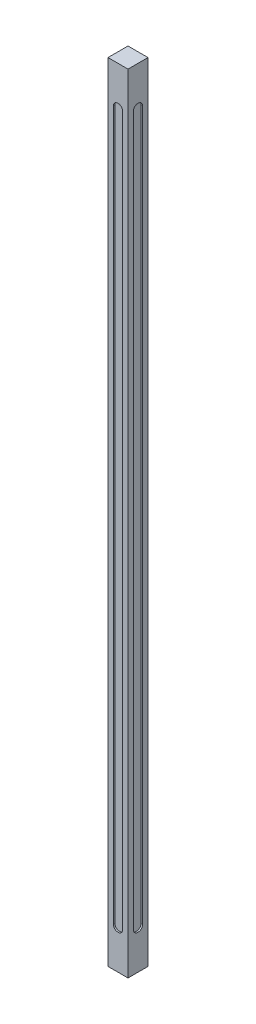
ISO-10303-21;
HEADER;
FILE_DESCRIPTION(('STEP AP214'),'2;1');
FILE_NAME('part.step','',(''),(''),'','','');
FILE_SCHEMA(('AUTOMOTIVE_DESIGN { 1 0 10303 214 1 1 1 1 }'));
ENDSEC;
DATA;
#1=APPLICATION_CONTEXT('core data for automotive mechanical design processes');
#2=APPLICATION_PROTOCOL_DEFINITION('international standard','automotive_design',2000,#1);
#3=PRODUCT_CONTEXT('',#1,'mechanical');
#4=PRODUCT('Part','Part','',(#3));
#5=PRODUCT_RELATED_PRODUCT_CATEGORY('part','',(#4));
#6=PRODUCT_DEFINITION_FORMATION('','',#4);
#7=PRODUCT_DEFINITION_CONTEXT('part definition',#1,'design');
#8=PRODUCT_DEFINITION('design','',#6,#7);
#9=PRODUCT_DEFINITION_SHAPE('','',#8);
#10=(LENGTH_UNIT() NAMED_UNIT(*) SI_UNIT(.MILLI.,.METRE.));
#11=(NAMED_UNIT(*) PLANE_ANGLE_UNIT() SI_UNIT($,.RADIAN.));
#12=(NAMED_UNIT(*) SI_UNIT($,.STERADIAN.) SOLID_ANGLE_UNIT());
#13=UNCERTAINTY_MEASURE_WITH_UNIT(LENGTH_MEASURE(1.E-05),#10,'distance_accuracy_value','');
#14=(GEOMETRIC_REPRESENTATION_CONTEXT(3) GLOBAL_UNCERTAINTY_ASSIGNED_CONTEXT((#13)) GLOBAL_UNIT_ASSIGNED_CONTEXT((#10,
#11,#12)) REPRESENTATION_CONTEXT('',''));
#15=CARTESIAN_POINT('',(0.,0.,0.));
#16=DIRECTION('',(0.,0.,1.));
#17=DIRECTION('',(1.,0.,0.));
#18=AXIS2_PLACEMENT_3D('',#15,#16,#17);
#19=CARTESIAN_POINT('',(-12.7,500.,12.7));
#20=DIRECTION('',(1.,0.,0.));
#21=DIRECTION('',(0.,0.,-1.));
#22=AXIS2_PLACEMENT_3D('',#19,#20,#21);
#23=PLANE('',#22);
#24=DIRECTION('',(0.,-1.,0.));
#25=VECTOR('',#24,1.);
#26=CARTESIAN_POINT('',(-12.7,450.,-6.00000000000017));
#27=LINE('',#26,#25);
#28=CARTESIAN_POINT('',(-12.7,450.,-6.00000000000017));
#29=VERTEX_POINT('',#28);
#30=CARTESIAN_POINT('',(-12.7,-450.,-5.99999999999989));
#31=VERTEX_POINT('',#30);
#32=EDGE_CURVE('E212',#29,#31,#27,.T.);
#33=ORIENTED_EDGE('',*,*,#32,.F.);
#34=CARTESIAN_POINT('',(-12.7,450.,-1.66978326577683E-13));
#35=DIRECTION('',(-1.,0.,0.));
#36=DIRECTION('',(0.,0.,1.));
#37=AXIS2_PLACEMENT_3D('',#34,#35,#36);
#38=CIRCLE('',#37,6.);
#39=CARTESIAN_POINT('',(-12.7,450.,5.99999999999984));
#40=VERTEX_POINT('',#39);
#41=EDGE_CURVE('E54',#40,#29,#38,.T.);
#42=ORIENTED_EDGE('',*,*,#41,.F.);
#43=DIRECTION('',(0.,1.,0.));
#44=VECTOR('',#43,1.);
#45=CARTESIAN_POINT('',(-12.7,450.,5.99999999999984));
#46=LINE('',#45,#44);
#47=CARTESIAN_POINT('',(-12.7,-450.,6.00000000000011));
#48=VERTEX_POINT('',#47);
#49=EDGE_CURVE('E199',#48,#40,#46,.T.);
#50=ORIENTED_EDGE('',*,*,#49,.F.);
#51=CARTESIAN_POINT('',(-12.7,-450.,1.08567203230471E-13));
#52=DIRECTION('',(-1.,0.,0.));
#53=DIRECTION('',(0.,0.,1.));
#54=AXIS2_PLACEMENT_3D('',#51,#52,#53);
#55=CIRCLE('',#54,6.);
#56=EDGE_CURVE('E203',#31,#48,#55,.T.);
#57=ORIENTED_EDGE('',*,*,#56,.F.);
#58=EDGE_LOOP('',(#33,#42,#50,#57));
#59=FACE_BOUND('',#58,.T.);
#60=DIRECTION('',(0.,0.,1.));
#61=VECTOR('',#60,1.);
#62=CARTESIAN_POINT('',(-12.7,-500.,12.7));
#63=LINE('',#62,#61);
#64=CARTESIAN_POINT('',(-12.7,-500.,-12.7));
#65=VERTEX_POINT('',#64);
#66=CARTESIAN_POINT('',(-12.7,-500.,12.7));
#67=VERTEX_POINT('',#66);
#68=EDGE_CURVE('E347',#65,#67,#63,.T.);
#69=ORIENTED_EDGE('',*,*,#68,.T.);
#70=DIRECTION('',(0.,-1.,0.));
#71=VECTOR('',#70,1.);
#72=CARTESIAN_POINT('',(-12.7,500.,12.7));
#73=LINE('',#72,#71);
#74=CARTESIAN_POINT('',(-12.7,500.,12.7));
#75=VERTEX_POINT('',#74);
#76=EDGE_CURVE('E11',#75,#67,#73,.T.);
#77=ORIENTED_EDGE('',*,*,#76,.F.);
#78=DIRECTION('',(0.,0.,1.));
#79=VECTOR('',#78,1.);
#80=CARTESIAN_POINT('',(-12.7,500.,12.7));
#81=LINE('',#80,#79);
#82=CARTESIAN_POINT('',(-12.7,500.,-12.7));
#83=VERTEX_POINT('',#82);
#84=EDGE_CURVE('E357',#83,#75,#81,.T.);
#85=ORIENTED_EDGE('',*,*,#84,.F.);
#86=DIRECTION('',(0.,-1.,0.));
#87=VECTOR('',#86,1.);
#88=CARTESIAN_POINT('',(-12.7,500.,-12.7));
#89=LINE('',#88,#87);
#90=EDGE_CURVE('E371',#83,#65,#89,.T.);
#91=ORIENTED_EDGE('',*,*,#90,.T.);
#92=EDGE_LOOP('',(#69,#77,#85,#91));
#93=FACE_BOUND('',#92,.T.);
#94=ADVANCED_FACE('F39',(#59,#93),#23,.F.);
#95=CARTESIAN_POINT('',(12.7,500.,12.7));
#96=DIRECTION('',(0.,0.,-1.));
#97=DIRECTION('',(-1.,0.,0.));
#98=AXIS2_PLACEMENT_3D('',#95,#96,#97);
#99=PLANE('',#98);
#100=DIRECTION('',(0.,-1.,0.));
#101=VECTOR('',#100,1.);
#102=CARTESIAN_POINT('',(-6.00000000000021,450.,12.7));
#103=LINE('',#102,#101);
#104=CARTESIAN_POINT('',(-6.00000000000021,450.,12.7));
#105=VERTEX_POINT('',#104);
#106=CARTESIAN_POINT('',(-5.99999999999993,-450.,12.7));
#107=VERTEX_POINT('',#106);
#108=EDGE_CURVE('E333',#105,#107,#103,.T.);
#109=ORIENTED_EDGE('',*,*,#108,.F.);
#110=CARTESIAN_POINT('',(-2.09939286241244E-13,450.,12.7));
#111=DIRECTION('',(0.,0.,1.));
#112=DIRECTION('',(1.,0.,0.));
#113=AXIS2_PLACEMENT_3D('',#110,#111,#112);
#114=CIRCLE('',#113,6.);
#115=CARTESIAN_POINT('',(5.99999999999979,450.,12.7));
#116=VERTEX_POINT('',#115);
#117=EDGE_CURVE('E303',#116,#105,#114,.T.);
#118=ORIENTED_EDGE('',*,*,#117,.F.);
#119=DIRECTION('',(0.,1.,0.));
#120=VECTOR('',#119,1.);
#121=CARTESIAN_POINT('',(5.99999999999979,450.,12.7));
#122=LINE('',#121,#120);
#123=CARTESIAN_POINT('',(6.00000000000006,-450.,12.7));
#124=VERTEX_POINT('',#123);
#125=EDGE_CURVE('E318',#124,#116,#122,.T.);
#126=ORIENTED_EDGE('',*,*,#125,.F.);
#127=CARTESIAN_POINT('',(0.,-450.,12.7));
#128=DIRECTION('',(0.,0.,1.));
#129=DIRECTION('',(1.,0.,0.));
#130=AXIS2_PLACEMENT_3D('',#127,#128,#129);
#131=CIRCLE('',#130,6.);
#132=EDGE_CURVE('E337',#107,#124,#131,.T.);
#133=ORIENTED_EDGE('',*,*,#132,.F.);
#134=EDGE_LOOP('',(#109,#118,#126,#133));
#135=FACE_BOUND('',#134,.T.);
#136=DIRECTION('',(1.,0.,0.));
#137=VECTOR('',#136,1.);
#138=CARTESIAN_POINT('',(12.7,-500.,12.7));
#139=LINE('',#138,#137);
#140=CARTESIAN_POINT('',(12.7,-500.,12.7));
#141=VERTEX_POINT('',#140);
#142=EDGE_CURVE('E375',#67,#141,#139,.T.);
#143=ORIENTED_EDGE('',*,*,#142,.T.);
#144=DIRECTION('',(0.,-1.,0.));
#145=VECTOR('',#144,1.);
#146=CARTESIAN_POINT('',(12.7,500.,12.7));
#147=LINE('',#146,#145);
#148=CARTESIAN_POINT('',(12.7,500.,12.7));
#149=VERTEX_POINT('',#148);
#150=EDGE_CURVE('E47',#149,#141,#147,.T.);
#151=ORIENTED_EDGE('',*,*,#150,.F.);
#152=DIRECTION('',(1.,0.,0.));
#153=VECTOR('',#152,1.);
#154=CARTESIAN_POINT('',(12.7,500.,12.7));
#155=LINE('',#154,#153);
#156=EDGE_CURVE('E361',#75,#149,#155,.T.);
#157=ORIENTED_EDGE('',*,*,#156,.F.);
#158=ORIENTED_EDGE('',*,*,#76,.T.);
#159=EDGE_LOOP('',(#143,#151,#157,#158));
#160=FACE_BOUND('',#159,.T.);
#161=ADVANCED_FACE('F411',(#135,#160),#99,.F.);
#162=CARTESIAN_POINT('',(12.7,500.,12.7));
#163=DIRECTION('',(-1.,0.,0.));
#164=DIRECTION('',(0.,0.,1.));
#165=AXIS2_PLACEMENT_3D('',#162,#163,#164);
#166=PLANE('',#165);
#167=DIRECTION('',(0.,-1.,0.));
#168=VECTOR('',#167,1.);
#169=CARTESIAN_POINT('',(12.7,450.,6.00000000000017));
#170=LINE('',#169,#168);
#171=CARTESIAN_POINT('',(12.7,450.,6.00000000000017));
#172=VERTEX_POINT('',#171);
#173=CARTESIAN_POINT('',(12.7,-450.,5.99999999999989));
#174=VERTEX_POINT('',#173);
#175=EDGE_CURVE('E289',#172,#174,#170,.T.);
#176=ORIENTED_EDGE('',*,*,#175,.F.);
#177=CARTESIAN_POINT('',(12.7,450.,1.64859035190274E-13));
#178=DIRECTION('',(1.,0.,0.));
#179=DIRECTION('',(0.,0.,-1.));
#180=AXIS2_PLACEMENT_3D('',#177,#178,#179);
#181=CIRCLE('',#180,6.);
#182=CARTESIAN_POINT('',(12.7,450.,-5.99999999999983));
#183=VERTEX_POINT('',#182);
#184=EDGE_CURVE('E260',#183,#172,#181,.T.);
#185=ORIENTED_EDGE('',*,*,#184,.F.);
#186=DIRECTION('',(0.,1.,0.));
#187=VECTOR('',#186,1.);
#188=CARTESIAN_POINT('',(12.7,450.,-5.99999999999983));
#189=LINE('',#188,#187);
#190=CARTESIAN_POINT('',(12.7,-450.,-6.00000000000011));
#191=VERTEX_POINT('',#190);
#192=EDGE_CURVE('E274',#191,#183,#189,.T.);
#193=ORIENTED_EDGE('',*,*,#192,.F.);
#194=CARTESIAN_POINT('',(12.7,-450.,-1.1068649461788E-13));
#195=DIRECTION('',(1.,0.,0.));
#196=DIRECTION('',(0.,0.,-1.));
#197=AXIS2_PLACEMENT_3D('',#194,#195,#196);
#198=CIRCLE('',#197,6.);
#199=EDGE_CURVE('E293',#174,#191,#198,.T.);
#200=ORIENTED_EDGE('',*,*,#199,.F.);
#201=EDGE_LOOP('',(#176,#185,#193,#200));
#202=FACE_BOUND('',#201,.T.);
#203=DIRECTION('',(0.,0.,-1.));
#204=VECTOR('',#203,1.);
#205=CARTESIAN_POINT('',(12.7,-500.,12.7));
#206=LINE('',#205,#204);
#207=CARTESIAN_POINT('',(12.7,-500.,-12.7));
#208=VERTEX_POINT('',#207);
#209=EDGE_CURVE('E378',#141,#208,#206,.T.);
#210=ORIENTED_EDGE('',*,*,#209,.T.);
#211=DIRECTION('',(0.,-1.,0.));
#212=VECTOR('',#211,1.);
#213=CARTESIAN_POINT('',(12.7,500.,-12.7));
#214=LINE('',#213,#212);
#215=CARTESIAN_POINT('',(12.7,500.,-12.7));
#216=VERTEX_POINT('',#215);
#217=EDGE_CURVE('E386',#216,#208,#214,.T.);
#218=ORIENTED_EDGE('',*,*,#217,.F.);
#219=DIRECTION('',(0.,0.,-1.));
#220=VECTOR('',#219,1.);
#221=CARTESIAN_POINT('',(12.7,500.,12.7));
#222=LINE('',#221,#220);
#223=EDGE_CURVE('E365',#149,#216,#222,.T.);
#224=ORIENTED_EDGE('',*,*,#223,.F.);
#225=ORIENTED_EDGE('',*,*,#150,.T.);
#226=EDGE_LOOP('',(#210,#218,#224,#225));
#227=FACE_BOUND('',#226,.T.);
#228=ADVANCED_FACE('F395',(#202,#227),#166,.F.);
#229=CARTESIAN_POINT('',(12.7,500.,-12.7));
#230=DIRECTION('',(0.,0.,1.));
#231=DIRECTION('',(1.,0.,0.));
#232=AXIS2_PLACEMENT_3D('',#229,#230,#231);
#233=PLANE('',#232);
#234=DIRECTION('',(0.,-1.,0.));
#235=VECTOR('',#234,1.);
#236=CARTESIAN_POINT('',(6.00000000000016,450.,-12.7));
#237=LINE('',#236,#235);
#238=CARTESIAN_POINT('',(6.00000000000016,450.,-12.7));
#239=VERTEX_POINT('',#238);
#240=CARTESIAN_POINT('',(5.99999999999989,-450.,-12.7));
#241=VERTEX_POINT('',#240);
#242=EDGE_CURVE('E246',#239,#241,#237,.T.);
#243=ORIENTED_EDGE('',*,*,#242,.F.);
#244=CARTESIAN_POINT('',(1.66623756488601E-13,450.,-12.7));
#245=DIRECTION('',(0.,0.,-1.));
#246=DIRECTION('',(-1.,0.,0.));
#247=AXIS2_PLACEMENT_3D('',#244,#245,#246);
#248=CIRCLE('',#247,6.);
#249=CARTESIAN_POINT('',(-5.99999999999984,450.,-12.7));
#250=VERTEX_POINT('',#249);
#251=EDGE_CURVE('E62',#250,#239,#248,.T.);
#252=ORIENTED_EDGE('',*,*,#251,.F.);
#253=DIRECTION('',(0.,1.,0.));
#254=VECTOR('',#253,1.);
#255=CARTESIAN_POINT('',(-5.99999999999984,450.,-12.7));
#256=LINE('',#255,#254);
#257=CARTESIAN_POINT('',(-6.00000000000011,-450.,-12.7));
#258=VERTEX_POINT('',#257);
#259=EDGE_CURVE('E231',#258,#250,#256,.T.);
#260=ORIENTED_EDGE('',*,*,#259,.F.);
#261=CARTESIAN_POINT('',(-1.08921773319553E-13,-450.,-12.7));
#262=DIRECTION('',(0.,0.,-1.));
#263=DIRECTION('',(-1.,0.,0.));
#264=AXIS2_PLACEMENT_3D('',#261,#262,#263);
#265=CIRCLE('',#264,6.);
#266=EDGE_CURVE('E250',#241,#258,#265,.T.);
#267=ORIENTED_EDGE('',*,*,#266,.F.);
#268=EDGE_LOOP('',(#243,#252,#260,#267));
#269=FACE_BOUND('',#268,.T.);
#270=DIRECTION('',(-1.,0.,0.));
#271=VECTOR('',#270,1.);
#272=CARTESIAN_POINT('',(12.7,-500.,-12.7));
#273=LINE('',#272,#271);
#274=EDGE_CURVE('E362',#208,#65,#273,.T.);
#275=ORIENTED_EDGE('',*,*,#274,.T.);
#276=ORIENTED_EDGE('',*,*,#90,.F.);
#277=DIRECTION('',(-1.,0.,0.));
#278=VECTOR('',#277,1.);
#279=CARTESIAN_POINT('',(12.7,500.,-12.7));
#280=LINE('',#279,#278);
#281=EDGE_CURVE('E368',#216,#83,#280,.T.);
#282=ORIENTED_EDGE('',*,*,#281,.F.);
#283=ORIENTED_EDGE('',*,*,#217,.T.);
#284=EDGE_LOOP('',(#275,#276,#282,#283));
#285=FACE_BOUND('',#284,.T.);
#286=ADVANCED_FACE('F404',(#269,#285),#233,.F.);
#287=CARTESIAN_POINT('',(0.,500.,0.));
#288=DIRECTION('',(0.,1.,0.));
#289=DIRECTION('',(0.,0.,1.));
#290=AXIS2_PLACEMENT_3D('',#287,#288,#289);
#291=PLANE('',#290);
#292=ORIENTED_EDGE('',*,*,#84,.T.);
#293=ORIENTED_EDGE('',*,*,#156,.T.);
#294=ORIENTED_EDGE('',*,*,#223,.T.);
#295=ORIENTED_EDGE('',*,*,#281,.T.);
#296=EDGE_LOOP('',(#292,#293,#294,#295));
#297=FACE_BOUND('',#296,.T.);
#298=ADVANCED_FACE('F410',(#297),#291,.T.);
#299=CARTESIAN_POINT('',(0.,-500.,0.));
#300=DIRECTION('',(0.,1.,0.));
#301=DIRECTION('',(0.,0.,1.));
#302=AXIS2_PLACEMENT_3D('',#299,#300,#301);
#303=PLANE('',#302);
#304=ORIENTED_EDGE('',*,*,#68,.F.);
#305=ORIENTED_EDGE('',*,*,#274,.F.);
#306=ORIENTED_EDGE('',*,*,#209,.F.);
#307=ORIENTED_EDGE('',*,*,#142,.F.);
#308=EDGE_LOOP('',(#304,#305,#306,#307));
#309=FACE_BOUND('',#308,.T.);
#310=ADVANCED_FACE('F401',(#309),#303,.F.);
#311=CARTESIAN_POINT('',(-2.09939286241244E-13,450.,10.7));
#312=DIRECTION('',(0.,0.,1.));
#313=DIRECTION('',(1.,0.,0.));
#314=AXIS2_PLACEMENT_3D('',#311,#312,#313);
#315=CYLINDRICAL_SURFACE('',#314,6.);
#316=ORIENTED_EDGE('',*,*,#117,.T.);
#317=DIRECTION('',(0.,0.,1.));
#318=VECTOR('',#317,1.);
#319=CARTESIAN_POINT('',(-6.00000000000021,450.,10.7));
#320=LINE('',#319,#318);
#321=CARTESIAN_POINT('',(-6.00000000000021,450.,10.7));
#322=VERTEX_POINT('',#321);
#323=EDGE_CURVE('E330',#322,#105,#320,.T.);
#324=ORIENTED_EDGE('',*,*,#323,.F.);
#325=CARTESIAN_POINT('',(-2.09939286241244E-13,450.,10.7));
#326=DIRECTION('',(0.,0.,1.));
#327=DIRECTION('',(1.,0.,0.));
#328=AXIS2_PLACEMENT_3D('',#325,#326,#327);
#329=CIRCLE('',#328,6.);
#330=CARTESIAN_POINT('',(5.99999999999979,450.,10.7));
#331=VERTEX_POINT('',#330);
#332=EDGE_CURVE('E313',#331,#322,#329,.T.);
#333=ORIENTED_EDGE('',*,*,#332,.F.);
#334=DIRECTION('',(0.,0.,1.));
#335=VECTOR('',#334,1.);
#336=CARTESIAN_POINT('',(5.99999999999979,450.,10.7));
#337=LINE('',#336,#335);
#338=EDGE_CURVE('E344',#331,#116,#337,.T.);
#339=ORIENTED_EDGE('',*,*,#338,.T.);
#340=EDGE_LOOP('',(#316,#324,#333,#339));
#341=FACE_BOUND('',#340,.T.);
#342=ADVANCED_FACE('F428',(#341),#315,.F.);
#343=CARTESIAN_POINT('',(5.99999999999979,450.,10.7));
#344=DIRECTION('',(1.,0.,0.));
#345=DIRECTION('',(0.,1.,0.));
#346=AXIS2_PLACEMENT_3D('',#343,#344,#345);
#347=PLANE('',#346);
#348=ORIENTED_EDGE('',*,*,#125,.T.);
#349=ORIENTED_EDGE('',*,*,#338,.F.);
#350=DIRECTION('',(0.,1.,0.));
#351=VECTOR('',#350,1.);
#352=CARTESIAN_POINT('',(5.99999999999979,450.,10.7));
#353=LINE('',#352,#351);
#354=CARTESIAN_POINT('',(6.00000000000006,-450.,10.7));
#355=VERTEX_POINT('',#354);
#356=EDGE_CURVE('E326',#355,#331,#353,.T.);
#357=ORIENTED_EDGE('',*,*,#356,.F.);
#358=DIRECTION('',(0.,0.,1.));
#359=VECTOR('',#358,1.);
#360=CARTESIAN_POINT('',(6.00000000000006,-450.,10.7));
#361=LINE('',#360,#359);
#362=EDGE_CURVE('E348',#355,#124,#361,.T.);
#363=ORIENTED_EDGE('',*,*,#362,.T.);
#364=EDGE_LOOP('',(#348,#349,#357,#363));
#365=FACE_BOUND('',#364,.T.);
#366=ADVANCED_FACE('F433',(#365),#347,.F.);
#367=CARTESIAN_POINT('',(0.,-450.,10.7));
#368=DIRECTION('',(0.,0.,1.));
#369=DIRECTION('',(1.,0.,0.));
#370=AXIS2_PLACEMENT_3D('',#367,#368,#369);
#371=CYLINDRICAL_SURFACE('',#370,6.);
#372=ORIENTED_EDGE('',*,*,#132,.T.);
#373=ORIENTED_EDGE('',*,*,#362,.F.);
#374=CARTESIAN_POINT('',(0.,-450.,10.7));
#375=DIRECTION('',(0.,0.,1.));
#376=DIRECTION('',(1.,0.,0.));
#377=AXIS2_PLACEMENT_3D('',#374,#375,#376);
#378=CIRCLE('',#377,6.);
#379=CARTESIAN_POINT('',(-5.99999999999993,-450.,10.7));
#380=VERTEX_POINT('',#379);
#381=EDGE_CURVE('E322',#380,#355,#378,.T.);
#382=ORIENTED_EDGE('',*,*,#381,.F.);
#383=DIRECTION('',(0.,0.,1.));
#384=VECTOR('',#383,1.);
#385=CARTESIAN_POINT('',(-5.99999999999993,-450.,10.7));
#386=LINE('',#385,#384);
#387=EDGE_CURVE('E351',#380,#107,#386,.T.);
#388=ORIENTED_EDGE('',*,*,#387,.T.);
#389=EDGE_LOOP('',(#372,#373,#382,#388));
#390=FACE_BOUND('',#389,.T.);
#391=ADVANCED_FACE('F439',(#390),#371,.F.);
#392=CARTESIAN_POINT('',(-6.00000000000021,450.,10.7));
#393=DIRECTION('',(-1.,0.,0.));
#394=DIRECTION('',(0.,-1.,0.));
#395=AXIS2_PLACEMENT_3D('',#392,#393,#394);
#396=PLANE('',#395);
#397=ORIENTED_EDGE('',*,*,#108,.T.);
#398=ORIENTED_EDGE('',*,*,#387,.F.);
#399=DIRECTION('',(0.,-1.,0.));
#400=VECTOR('',#399,1.);
#401=CARTESIAN_POINT('',(-6.00000000000021,450.,10.7));
#402=LINE('',#401,#400);
#403=EDGE_CURVE('E317',#322,#380,#402,.T.);
#404=ORIENTED_EDGE('',*,*,#403,.F.);
#405=ORIENTED_EDGE('',*,*,#323,.T.);
#406=EDGE_LOOP('',(#397,#398,#404,#405));
#407=FACE_BOUND('',#406,.T.);
#408=ADVANCED_FACE('F435',(#407),#396,.F.);
#409=CARTESIAN_POINT('',(-2.09939286241244E-13,450.,10.7));
#410=DIRECTION('',(0.,0.,1.));
#411=DIRECTION('',(1.,0.,0.));
#412=AXIS2_PLACEMENT_3D('',#409,#410,#411);
#413=PLANE('',#412);
#414=ORIENTED_EDGE('',*,*,#332,.T.);
#415=ORIENTED_EDGE('',*,*,#403,.T.);
#416=ORIENTED_EDGE('',*,*,#381,.T.);
#417=ORIENTED_EDGE('',*,*,#356,.T.);
#418=EDGE_LOOP('',(#414,#415,#416,#417));
#419=FACE_BOUND('',#418,.T.);
#420=ADVANCED_FACE('F438',(#419),#413,.T.);
#421=CARTESIAN_POINT('',(10.7,450.,1.64859035190274E-13));
#422=DIRECTION('',(1.,0.,0.));
#423=DIRECTION('',(0.,0.,-1.));
#424=AXIS2_PLACEMENT_3D('',#421,#422,#423);
#425=CYLINDRICAL_SURFACE('',#424,6.);
#426=ORIENTED_EDGE('',*,*,#184,.T.);
#427=DIRECTION('',(1.,0.,0.));
#428=VECTOR('',#427,1.);
#429=CARTESIAN_POINT('',(10.7,450.,6.00000000000017));
#430=LINE('',#429,#428);
#431=CARTESIAN_POINT('',(10.7,450.,6.00000000000017));
#432=VERTEX_POINT('',#431);
#433=EDGE_CURVE('E286',#432,#172,#430,.T.);
#434=ORIENTED_EDGE('',*,*,#433,.F.);
#435=CARTESIAN_POINT('',(10.7,450.,1.64859035190274E-13));
#436=DIRECTION('',(1.,0.,0.));
#437=DIRECTION('',(0.,0.,-1.));
#438=AXIS2_PLACEMENT_3D('',#435,#436,#437);
#439=CIRCLE('',#438,6.);
#440=CARTESIAN_POINT('',(10.7,450.,-5.99999999999983));
#441=VERTEX_POINT('',#440);
#442=EDGE_CURVE('E269',#441,#432,#439,.T.);
#443=ORIENTED_EDGE('',*,*,#442,.F.);
#444=DIRECTION('',(1.,0.,0.));
#445=VECTOR('',#444,1.);
#446=CARTESIAN_POINT('',(10.7,450.,-5.99999999999983));
#447=LINE('',#446,#445);
#448=EDGE_CURVE('E300',#441,#183,#447,.T.);
#449=ORIENTED_EDGE('',*,*,#448,.T.);
#450=EDGE_LOOP('',(#426,#434,#443,#449));
#451=FACE_BOUND('',#450,.T.);
#452=ADVANCED_FACE('F449',(#451),#425,.F.);
#453=CARTESIAN_POINT('',(10.7,450.,-5.99999999999983));
#454=DIRECTION('',(0.,0.,-1.));
#455=DIRECTION('',(0.,1.,0.));
#456=AXIS2_PLACEMENT_3D('',#453,#454,#455);
#457=PLANE('',#456);
#458=ORIENTED_EDGE('',*,*,#192,.T.);
#459=ORIENTED_EDGE('',*,*,#448,.F.);
#460=DIRECTION('',(0.,1.,0.));
#461=VECTOR('',#460,1.);
#462=CARTESIAN_POINT('',(10.7,450.,-5.99999999999983));
#463=LINE('',#462,#461);
#464=CARTESIAN_POINT('',(10.7,-450.,-6.00000000000011));
#465=VERTEX_POINT('',#464);
#466=EDGE_CURVE('E282',#465,#441,#463,.T.);
#467=ORIENTED_EDGE('',*,*,#466,.F.);
#468=DIRECTION('',(1.,0.,0.));
#469=VECTOR('',#468,1.);
#470=CARTESIAN_POINT('',(10.7,-450.,-6.00000000000011));
#471=LINE('',#470,#469);
#472=EDGE_CURVE('E304',#465,#191,#471,.T.);
#473=ORIENTED_EDGE('',*,*,#472,.T.);
#474=EDGE_LOOP('',(#458,#459,#467,#473));
#475=FACE_BOUND('',#474,.T.);
#476=ADVANCED_FACE('F453',(#475),#457,.F.);
#477=CARTESIAN_POINT('',(10.7,-450.,-1.1068649461788E-13));
#478=DIRECTION('',(1.,0.,0.));
#479=DIRECTION('',(0.,0.,-1.));
#480=AXIS2_PLACEMENT_3D('',#477,#478,#479);
#481=CYLINDRICAL_SURFACE('',#480,6.);
#482=ORIENTED_EDGE('',*,*,#199,.T.);
#483=ORIENTED_EDGE('',*,*,#472,.F.);
#484=CARTESIAN_POINT('',(10.7,-450.,-1.1068649461788E-13));
#485=DIRECTION('',(1.,0.,0.));
#486=DIRECTION('',(0.,0.,-1.));
#487=AXIS2_PLACEMENT_3D('',#484,#485,#486);
#488=CIRCLE('',#487,6.);
#489=CARTESIAN_POINT('',(10.7,-450.,5.99999999999989));
#490=VERTEX_POINT('',#489);
#491=EDGE_CURVE('E278',#490,#465,#488,.T.);
#492=ORIENTED_EDGE('',*,*,#491,.F.);
#493=DIRECTION('',(1.,0.,0.));
#494=VECTOR('',#493,1.);
#495=CARTESIAN_POINT('',(10.7,-450.,5.99999999999989));
#496=LINE('',#495,#494);
#497=EDGE_CURVE('E307',#490,#174,#496,.T.);
#498=ORIENTED_EDGE('',*,*,#497,.T.);
#499=EDGE_LOOP('',(#482,#483,#492,#498));
#500=FACE_BOUND('',#499,.T.);
#501=ADVANCED_FACE('F459',(#500),#481,.F.);
#502=CARTESIAN_POINT('',(10.7,450.,6.00000000000017));
#503=DIRECTION('',(0.,0.,1.));
#504=DIRECTION('',(0.,-1.,0.));
#505=AXIS2_PLACEMENT_3D('',#502,#503,#504);
#506=PLANE('',#505);
#507=ORIENTED_EDGE('',*,*,#175,.T.);
#508=ORIENTED_EDGE('',*,*,#497,.F.);
#509=DIRECTION('',(0.,-1.,0.));
#510=VECTOR('',#509,1.);
#511=CARTESIAN_POINT('',(10.7,450.,6.00000000000017));
#512=LINE('',#511,#510);
#513=EDGE_CURVE('E273',#432,#490,#512,.T.);
#514=ORIENTED_EDGE('',*,*,#513,.F.);
#515=ORIENTED_EDGE('',*,*,#433,.T.);
#516=EDGE_LOOP('',(#507,#508,#514,#515));
#517=FACE_BOUND('',#516,.T.);
#518=ADVANCED_FACE('F455',(#517),#506,.F.);
#519=CARTESIAN_POINT('',(10.7,450.,1.64859035190274E-13));
#520=DIRECTION('',(1.,0.,0.));
#521=DIRECTION('',(0.,0.,-1.));
#522=AXIS2_PLACEMENT_3D('',#519,#520,#521);
#523=PLANE('',#522);
#524=ORIENTED_EDGE('',*,*,#442,.T.);
#525=ORIENTED_EDGE('',*,*,#513,.T.);
#526=ORIENTED_EDGE('',*,*,#491,.T.);
#527=ORIENTED_EDGE('',*,*,#466,.T.);
#528=EDGE_LOOP('',(#524,#525,#526,#527));
#529=FACE_BOUND('',#528,.T.);
#530=ADVANCED_FACE('F458',(#529),#523,.T.);
#531=CARTESIAN_POINT('',(1.66896941287968E-13,450.,-10.7));
#532=DIRECTION('',(0.,0.,-1.));
#533=DIRECTION('',(-1.,0.,0.));
#534=AXIS2_PLACEMENT_3D('',#531,#532,#533);
#535=CYLINDRICAL_SURFACE('',#534,6.);
#536=ORIENTED_EDGE('',*,*,#251,.T.);
#537=DIRECTION('',(0.,0.,-1.));
#538=VECTOR('',#537,1.);
#539=CARTESIAN_POINT('',(6.00000000000016,450.,-10.7));
#540=LINE('',#539,#538);
#541=CARTESIAN_POINT('',(6.00000000000016,450.,-10.7));
#542=VERTEX_POINT('',#541);
#543=EDGE_CURVE('E243',#542,#239,#540,.T.);
#544=ORIENTED_EDGE('',*,*,#543,.F.);
#545=CARTESIAN_POINT('',(1.66896941287968E-13,450.,-10.7));
#546=DIRECTION('',(0.,0.,-1.));
#547=DIRECTION('',(-1.,0.,0.));
#548=AXIS2_PLACEMENT_3D('',#545,#546,#547);
#549=CIRCLE('',#548,6.);
#550=CARTESIAN_POINT('',(-5.99999999999984,450.,-10.7));
#551=VERTEX_POINT('',#550);
#552=EDGE_CURVE('E226',#551,#542,#549,.T.);
#553=ORIENTED_EDGE('',*,*,#552,.F.);
#554=DIRECTION('',(0.,0.,-1.));
#555=VECTOR('',#554,1.);
#556=CARTESIAN_POINT('',(-5.99999999999984,450.,-10.7));
#557=LINE('',#556,#555);
#558=EDGE_CURVE('E257',#551,#250,#557,.T.);
#559=ORIENTED_EDGE('',*,*,#558,.T.);
#560=EDGE_LOOP('',(#536,#544,#553,#559));
#561=FACE_BOUND('',#560,.T.);
#562=ADVANCED_FACE('F469',(#561),#535,.F.);
#563=CARTESIAN_POINT('',(-5.99999999999984,450.,-10.7));
#564=DIRECTION('',(-1.,0.,0.));
#565=DIRECTION('',(0.,-1.,0.));
#566=AXIS2_PLACEMENT_3D('',#563,#564,#565);
#567=PLANE('',#566);
#568=ORIENTED_EDGE('',*,*,#259,.T.);
#569=ORIENTED_EDGE('',*,*,#558,.F.);
#570=DIRECTION('',(0.,1.,0.));
#571=VECTOR('',#570,1.);
#572=CARTESIAN_POINT('',(-5.99999999999984,450.,-10.7));
#573=LINE('',#572,#571);
#574=CARTESIAN_POINT('',(-6.00000000000011,-450.,-10.7));
#575=VERTEX_POINT('',#574);
#576=EDGE_CURVE('E239',#575,#551,#573,.T.);
#577=ORIENTED_EDGE('',*,*,#576,.F.);
#578=DIRECTION('',(0.,0.,-1.));
#579=VECTOR('',#578,1.);
#580=CARTESIAN_POINT('',(-6.00000000000011,-450.,-10.7));
#581=LINE('',#580,#579);
#582=EDGE_CURVE('E261',#575,#258,#581,.T.);
#583=ORIENTED_EDGE('',*,*,#582,.T.);
#584=EDGE_LOOP('',(#568,#569,#577,#583));
#585=FACE_BOUND('',#584,.T.);
#586=ADVANCED_FACE('F473',(#585),#567,.F.);
#587=CARTESIAN_POINT('',(-1.08648588520187E-13,-450.,-10.7));
#588=DIRECTION('',(0.,0.,-1.));
#589=DIRECTION('',(-1.,0.,0.));
#590=AXIS2_PLACEMENT_3D('',#587,#588,#589);
#591=CYLINDRICAL_SURFACE('',#590,6.);
#592=ORIENTED_EDGE('',*,*,#266,.T.);
#593=ORIENTED_EDGE('',*,*,#582,.F.);
#594=CARTESIAN_POINT('',(-1.08648588520187E-13,-450.,-10.7));
#595=DIRECTION('',(0.,0.,-1.));
#596=DIRECTION('',(-1.,0.,0.));
#597=AXIS2_PLACEMENT_3D('',#594,#595,#596);
#598=CIRCLE('',#597,6.);
#599=CARTESIAN_POINT('',(5.99999999999989,-450.,-10.7));
#600=VERTEX_POINT('',#599);
#601=EDGE_CURVE('E235',#600,#575,#598,.T.);
#602=ORIENTED_EDGE('',*,*,#601,.F.);
#603=DIRECTION('',(0.,0.,-1.));
#604=VECTOR('',#603,1.);
#605=CARTESIAN_POINT('',(5.99999999999989,-450.,-10.7));
#606=LINE('',#605,#604);
#607=EDGE_CURVE('E264',#600,#241,#606,.T.);
#608=ORIENTED_EDGE('',*,*,#607,.T.);
#609=EDGE_LOOP('',(#592,#593,#602,#608));
#610=FACE_BOUND('',#609,.T.);
#611=ADVANCED_FACE('F478',(#610),#591,.F.);
#612=CARTESIAN_POINT('',(6.00000000000016,450.,-10.7));
#613=DIRECTION('',(1.,0.,0.));
#614=DIRECTION('',(0.,1.,0.));
#615=AXIS2_PLACEMENT_3D('',#612,#613,#614);
#616=PLANE('',#615);
#617=ORIENTED_EDGE('',*,*,#242,.T.);
#618=ORIENTED_EDGE('',*,*,#607,.F.);
#619=DIRECTION('',(0.,-1.,0.));
#620=VECTOR('',#619,1.);
#621=CARTESIAN_POINT('',(6.00000000000016,450.,-10.7));
#622=LINE('',#621,#620);
#623=EDGE_CURVE('E230',#542,#600,#622,.T.);
#624=ORIENTED_EDGE('',*,*,#623,.F.);
#625=ORIENTED_EDGE('',*,*,#543,.T.);
#626=EDGE_LOOP('',(#617,#618,#624,#625));
#627=FACE_BOUND('',#626,.T.);
#628=ADVANCED_FACE('F474',(#627),#616,.F.);
#629=CARTESIAN_POINT('',(1.66896941287968E-13,450.,-10.7));
#630=DIRECTION('',(0.,0.,-1.));
#631=DIRECTION('',(-1.,0.,0.));
#632=AXIS2_PLACEMENT_3D('',#629,#630,#631);
#633=PLANE('',#632);
#634=ORIENTED_EDGE('',*,*,#552,.T.);
#635=ORIENTED_EDGE('',*,*,#623,.T.);
#636=ORIENTED_EDGE('',*,*,#601,.T.);
#637=ORIENTED_EDGE('',*,*,#576,.T.);
#638=EDGE_LOOP('',(#634,#635,#636,#637));
#639=FACE_BOUND('',#638,.T.);
#640=ADVANCED_FACE('F477',(#639),#633,.T.);
#641=CARTESIAN_POINT('',(-10.7,450.,-1.66978326577683E-13));
#642=DIRECTION('',(-1.,0.,0.));
#643=DIRECTION('',(0.,0.,1.));
#644=AXIS2_PLACEMENT_3D('',#641,#642,#643);
#645=CYLINDRICAL_SURFACE('',#644,6.);
#646=ORIENTED_EDGE('',*,*,#41,.T.);
#647=DIRECTION('',(-1.,0.,0.));
#648=VECTOR('',#647,1.);
#649=CARTESIAN_POINT('',(-10.7,450.,-6.00000000000017));
#650=LINE('',#649,#648);
#651=CARTESIAN_POINT('',(-10.7,450.,-6.00000000000017));
#652=VERTEX_POINT('',#651);
#653=EDGE_CURVE('E174',#652,#29,#650,.T.);
#654=ORIENTED_EDGE('',*,*,#653,.F.);
#655=CARTESIAN_POINT('',(-10.7,450.,-1.66978326577683E-13));
#656=DIRECTION('',(-1.,0.,0.));
#657=DIRECTION('',(0.,0.,1.));
#658=AXIS2_PLACEMENT_3D('',#655,#656,#657);
#659=CIRCLE('',#658,6.);
#660=CARTESIAN_POINT('',(-10.7,450.,5.99999999999984));
#661=VERTEX_POINT('',#660);
#662=EDGE_CURVE('E178',#661,#652,#659,.T.);
#663=ORIENTED_EDGE('',*,*,#662,.F.);
#664=DIRECTION('',(-1.,0.,0.));
#665=VECTOR('',#664,1.);
#666=CARTESIAN_POINT('',(-10.7,450.,5.99999999999984));
#667=LINE('',#666,#665);
#668=EDGE_CURVE('E218',#661,#40,#667,.T.);
#669=ORIENTED_EDGE('',*,*,#668,.T.);
#670=EDGE_LOOP('',(#646,#654,#663,#669));
#671=FACE_BOUND('',#670,.T.);
#672=ADVANCED_FACE('F176',(#671),#645,.F.);
#673=CARTESIAN_POINT('',(-10.7,450.,5.99999999999984));
#674=DIRECTION('',(0.,0.,1.));
#675=DIRECTION('',(0.,-1.,0.));
#676=AXIS2_PLACEMENT_3D('',#673,#674,#675);
#677=PLANE('',#676);
#678=ORIENTED_EDGE('',*,*,#49,.T.);
#679=ORIENTED_EDGE('',*,*,#668,.F.);
#680=DIRECTION('',(0.,1.,0.));
#681=VECTOR('',#680,1.);
#682=CARTESIAN_POINT('',(-10.7,450.,5.99999999999984));
#683=LINE('',#682,#681);
#684=CARTESIAN_POINT('',(-10.7,-450.,6.00000000000011));
#685=VERTEX_POINT('',#684);
#686=EDGE_CURVE('E185',#685,#661,#683,.T.);
#687=ORIENTED_EDGE('',*,*,#686,.F.);
#688=DIRECTION('',(-1.,0.,0.));
#689=VECTOR('',#688,1.);
#690=CARTESIAN_POINT('',(-10.7,-450.,6.00000000000011));
#691=LINE('',#690,#689);
#692=EDGE_CURVE('E221',#685,#48,#691,.T.);
#693=ORIENTED_EDGE('',*,*,#692,.T.);
#694=EDGE_LOOP('',(#678,#679,#687,#693));
#695=FACE_BOUND('',#694,.T.);
#696=ADVANCED_FACE('F491',(#695),#677,.F.);
#697=CARTESIAN_POINT('',(-10.7,-450.,1.08567203230471E-13));
#698=DIRECTION('',(-1.,0.,0.));
#699=DIRECTION('',(0.,0.,1.));
#700=AXIS2_PLACEMENT_3D('',#697,#698,#699);
#701=CYLINDRICAL_SURFACE('',#700,6.);
#702=ORIENTED_EDGE('',*,*,#56,.T.);
#703=ORIENTED_EDGE('',*,*,#692,.F.);
#704=CARTESIAN_POINT('',(-10.7,-450.,1.08567203230471E-13));
#705=DIRECTION('',(-1.,0.,0.));
#706=DIRECTION('',(0.,0.,1.));
#707=AXIS2_PLACEMENT_3D('',#704,#705,#706);
#708=CIRCLE('',#707,6.);
#709=CARTESIAN_POINT('',(-10.7,-450.,-5.99999999999989));
#710=VERTEX_POINT('',#709);
#711=EDGE_CURVE('E194',#710,#685,#708,.T.);
#712=ORIENTED_EDGE('',*,*,#711,.F.);
#713=DIRECTION('',(-1.,0.,0.));
#714=VECTOR('',#713,1.);
#715=CARTESIAN_POINT('',(-10.7,-450.,-5.99999999999989));
#716=LINE('',#715,#714);
#717=EDGE_CURVE('E184',#710,#31,#716,.T.);
#718=ORIENTED_EDGE('',*,*,#717,.T.);
#719=EDGE_LOOP('',(#702,#703,#712,#718));
#720=FACE_BOUND('',#719,.T.);
#721=ADVANCED_FACE('F494',(#720),#701,.F.);
#722=CARTESIAN_POINT('',(-10.7,450.,-6.00000000000017));
#723=DIRECTION('',(0.,0.,-1.));
#724=DIRECTION('',(0.,1.,0.));
#725=AXIS2_PLACEMENT_3D('',#722,#723,#724);
#726=PLANE('',#725);
#727=ORIENTED_EDGE('',*,*,#32,.T.);
#728=ORIENTED_EDGE('',*,*,#717,.F.);
#729=DIRECTION('',(0.,-1.,0.));
#730=VECTOR('',#729,1.);
#731=CARTESIAN_POINT('',(-10.7,450.,-6.00000000000017));
#732=LINE('',#731,#730);
#733=EDGE_CURVE('E188',#652,#710,#732,.T.);
#734=ORIENTED_EDGE('',*,*,#733,.F.);
#735=ORIENTED_EDGE('',*,*,#653,.T.);
#736=EDGE_LOOP('',(#727,#728,#734,#735));
#737=FACE_BOUND('',#736,.T.);
#738=ADVANCED_FACE('F189',(#737),#726,.F.);
#739=CARTESIAN_POINT('',(-10.7,450.,-1.66978326577683E-13));
#740=DIRECTION('',(-1.,0.,0.));
#741=DIRECTION('',(0.,0.,1.));
#742=AXIS2_PLACEMENT_3D('',#739,#740,#741);
#743=PLANE('',#742);
#744=ORIENTED_EDGE('',*,*,#662,.T.);
#745=ORIENTED_EDGE('',*,*,#733,.T.);
#746=ORIENTED_EDGE('',*,*,#711,.T.);
#747=ORIENTED_EDGE('',*,*,#686,.T.);
#748=EDGE_LOOP('',(#744,#745,#746,#747));
#749=FACE_BOUND('',#748,.T.);
#750=ADVANCED_FACE('F196',(#749),#743,.T.);
#751=CLOSED_SHELL('',(#94,#161,#228,#286,#298,#310,#342,#366,#391,#408,#420,#452,#476,#501,#518,
#530,#562,#586,#611,#628,#640,#672,#696,#721,#738,#750));
#752=MANIFOLD_SOLID_BREP('B2',#751);
#753=ADVANCED_BREP_SHAPE_REPRESENTATION('',(#18,#752),#14);
#754=SHAPE_DEFINITION_REPRESENTATION(#9,#753);
ENDSEC;
END-ISO-10303-21;
